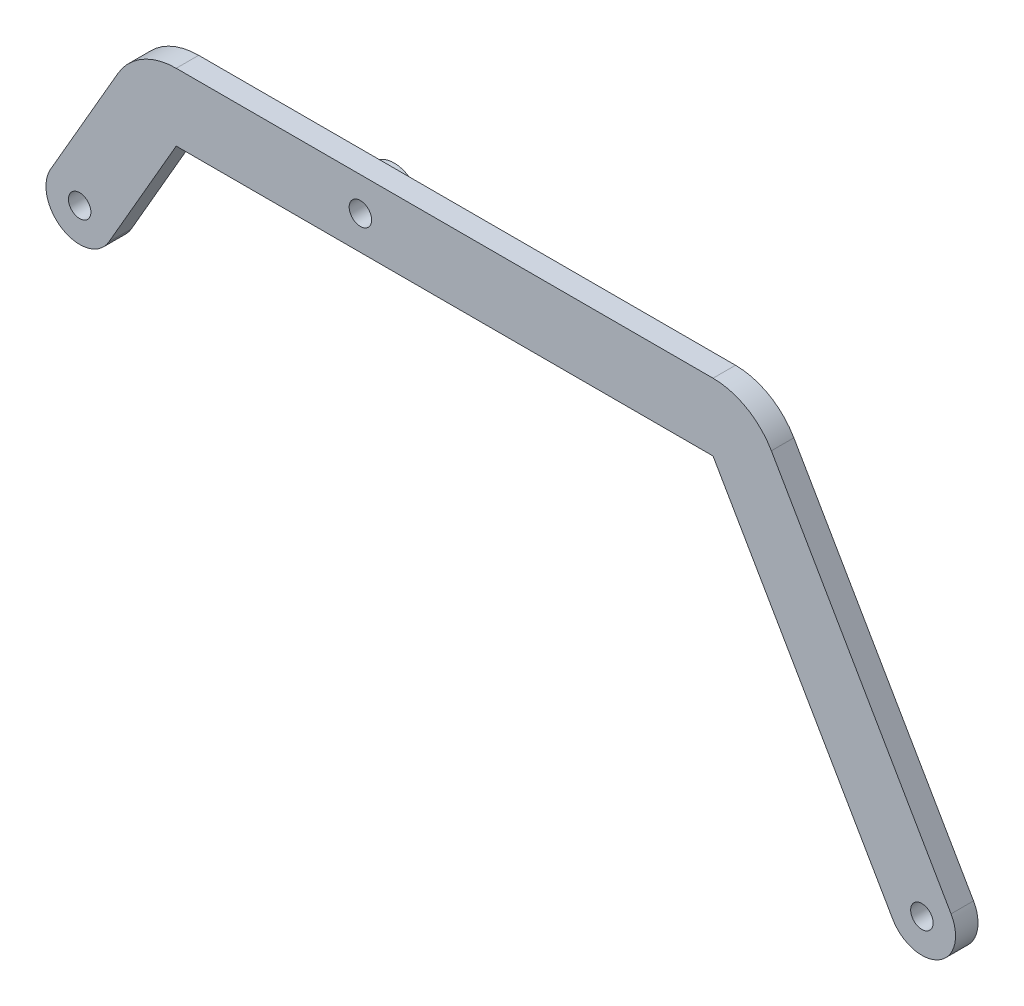
ISO-10303-21;
HEADER;
FILE_DESCRIPTION(('STEP AP214'),'2;1');
FILE_NAME('part.step','',(''),(''),'','','');
FILE_SCHEMA(('AUTOMOTIVE_DESIGN { 1 0 10303 214 1 1 1 1 }'));
ENDSEC;
DATA;
#1=APPLICATION_CONTEXT('core data for automotive mechanical design processes');
#2=APPLICATION_PROTOCOL_DEFINITION('international standard','automotive_design',2000,#1);
#3=PRODUCT_CONTEXT('',#1,'mechanical');
#4=PRODUCT('Part','Part','',(#3));
#5=PRODUCT_RELATED_PRODUCT_CATEGORY('part','',(#4));
#6=PRODUCT_DEFINITION_FORMATION('','',#4);
#7=PRODUCT_DEFINITION_CONTEXT('part definition',#1,'design');
#8=PRODUCT_DEFINITION('design','',#6,#7);
#9=PRODUCT_DEFINITION_SHAPE('','',#8);
#10=(LENGTH_UNIT() NAMED_UNIT(*) SI_UNIT(.MILLI.,.METRE.));
#11=(NAMED_UNIT(*) PLANE_ANGLE_UNIT() SI_UNIT($,.RADIAN.));
#12=(NAMED_UNIT(*) SI_UNIT($,.STERADIAN.) SOLID_ANGLE_UNIT());
#13=UNCERTAINTY_MEASURE_WITH_UNIT(LENGTH_MEASURE(1.E-05),#10,'distance_accuracy_value','');
#14=(GEOMETRIC_REPRESENTATION_CONTEXT(3) GLOBAL_UNCERTAINTY_ASSIGNED_CONTEXT((#13)) GLOBAL_UNIT_ASSIGNED_CONTEXT((#10,
#11,#12)) REPRESENTATION_CONTEXT('',''));
#15=CARTESIAN_POINT('',(0.,0.,0.));
#16=DIRECTION('',(0.,0.,1.));
#17=DIRECTION('',(1.,0.,0.));
#18=AXIS2_PLACEMENT_3D('',#15,#16,#17);
#19=CARTESIAN_POINT('',(-82.0096189432334,-15.,10.));
#20=DIRECTION('',(0.,0.,-1.));
#21=DIRECTION('',(-1.,0.,0.));
#22=AXIS2_PLACEMENT_3D('',#19,#20,#21);
#23=CYLINDRICAL_SURFACE('',#22,30.);
#24=CARTESIAN_POINT('',(-82.0096189432334,-15.,0.));
#25=DIRECTION('',(0.,0.,1.));
#26=DIRECTION('',(-1.,0.,0.));
#27=AXIS2_PLACEMENT_3D('',#24,#25,#26);
#28=CIRCLE('',#27,30.);
#29=CARTESIAN_POINT('',(-82.0096189432334,15.,0.));
#30=VERTEX_POINT('',#29);
#31=CARTESIAN_POINT('',(-107.990381056767,0.,0.));
#32=VERTEX_POINT('',#31);
#33=EDGE_CURVE('E153',#30,#32,#28,.T.);
#34=ORIENTED_EDGE('',*,*,#33,.T.);
#35=DIRECTION('',(0.,0.,-1.));
#36=VECTOR('',#35,1.);
#37=CARTESIAN_POINT('',(-107.990381056767,0.,10.));
#38=LINE('',#37,#36);
#39=CARTESIAN_POINT('',(-107.990381056767,0.,10.));
#40=VERTEX_POINT('',#39);
#41=EDGE_CURVE('E49',#40,#32,#38,.T.);
#42=ORIENTED_EDGE('',*,*,#41,.F.);
#43=CARTESIAN_POINT('',(-82.0096189432334,-15.,10.));
#44=DIRECTION('',(0.,0.,1.));
#45=DIRECTION('',(-1.,0.,0.));
#46=AXIS2_PLACEMENT_3D('',#43,#44,#45);
#47=CIRCLE('',#46,30.);
#48=CARTESIAN_POINT('',(-82.0096189432334,15.,10.));
#49=VERTEX_POINT('',#48);
#50=EDGE_CURVE('E107',#49,#40,#47,.T.);
#51=ORIENTED_EDGE('',*,*,#50,.F.);
#52=DIRECTION('',(0.,0.,-1.));
#53=VECTOR('',#52,1.);
#54=CARTESIAN_POINT('',(-82.0096189432334,15.,10.));
#55=LINE('',#54,#53);
#56=EDGE_CURVE('E11',#49,#30,#55,.T.);
#57=ORIENTED_EDGE('',*,*,#56,.T.);
#58=EDGE_LOOP('',(#34,#42,#51,#57));
#59=FACE_BOUND('',#58,.T.);
#60=ADVANCED_FACE('F41',(#59),#23,.T.);
#61=CARTESIAN_POINT('',(-137.990381056767,-51.9615242270663,10.));
#62=DIRECTION('',(0.866025403784438,-0.5,0.));
#63=DIRECTION('',(0.5,0.866025403784438,0.));
#64=AXIS2_PLACEMENT_3D('',#61,#62,#63);
#65=PLANE('',#64);
#66=DIRECTION('',(-0.5,-0.866025403784438,0.));
#67=VECTOR('',#66,1.);
#68=CARTESIAN_POINT('',(-137.990381056767,-51.9615242270663,0.));
#69=LINE('',#68,#67);
#70=CARTESIAN_POINT('',(-137.990381056767,-51.9615242270663,0.));
#71=VERTEX_POINT('',#70);
#72=EDGE_CURVE('E155',#32,#71,#69,.T.);
#73=ORIENTED_EDGE('',*,*,#72,.T.);
#74=DIRECTION('',(0.,0.,-1.));
#75=VECTOR('',#74,1.);
#76=CARTESIAN_POINT('',(-137.990381056767,-51.9615242270663,10.));
#77=LINE('',#76,#75);
#78=CARTESIAN_POINT('',(-137.990381056767,-51.9615242270663,10.));
#79=VERTEX_POINT('',#78);
#80=EDGE_CURVE('E184',#79,#71,#77,.T.);
#81=ORIENTED_EDGE('',*,*,#80,.F.);
#82=DIRECTION('',(-0.5,-0.866025403784438,0.));
#83=VECTOR('',#82,1.);
#84=CARTESIAN_POINT('',(-137.990381056767,-51.9615242270663,10.));
#85=LINE('',#84,#83);
#86=EDGE_CURVE('E192',#40,#79,#85,.T.);
#87=ORIENTED_EDGE('',*,*,#86,.F.);
#88=ORIENTED_EDGE('',*,*,#41,.T.);
#89=EDGE_LOOP('',(#73,#81,#87,#88));
#90=FACE_BOUND('',#89,.T.);
#91=ADVANCED_FACE('F190',(#90),#65,.F.);
#92=CARTESIAN_POINT('',(-125.,-59.4615242270663,10.));
#93=DIRECTION('',(0.,0.,-1.));
#94=DIRECTION('',(-1.,0.,0.));
#95=AXIS2_PLACEMENT_3D('',#92,#93,#94);
#96=CYLINDRICAL_SURFACE('',#95,15.);
#97=CARTESIAN_POINT('',(-125.,-59.4615242270663,0.));
#98=DIRECTION('',(0.,0.,1.));
#99=DIRECTION('',(1.,0.,0.));
#100=AXIS2_PLACEMENT_3D('',#97,#98,#99);
#101=CIRCLE('',#100,15.);
#102=CARTESIAN_POINT('',(-112.009618943233,-66.9615242270663,0.));
#103=VERTEX_POINT('',#102);
#104=EDGE_CURVE('E158',#71,#103,#101,.T.);
#105=ORIENTED_EDGE('',*,*,#104,.T.);
#106=DIRECTION('',(0.,0.,-1.));
#107=VECTOR('',#106,1.);
#108=CARTESIAN_POINT('',(-112.009618943233,-66.9615242270663,10.));
#109=LINE('',#108,#107);
#110=CARTESIAN_POINT('',(-112.009618943233,-66.9615242270663,10.));
#111=VERTEX_POINT('',#110);
#112=EDGE_CURVE('E181',#111,#103,#109,.T.);
#113=ORIENTED_EDGE('',*,*,#112,.F.);
#114=CARTESIAN_POINT('',(-125.,-59.4615242270663,10.));
#115=DIRECTION('',(0.,0.,1.));
#116=DIRECTION('',(1.,0.,0.));
#117=AXIS2_PLACEMENT_3D('',#114,#115,#116);
#118=CIRCLE('',#117,15.);
#119=EDGE_CURVE('E210',#79,#111,#118,.T.);
#120=ORIENTED_EDGE('',*,*,#119,.F.);
#121=ORIENTED_EDGE('',*,*,#80,.T.);
#122=EDGE_LOOP('',(#105,#113,#120,#121));
#123=FACE_BOUND('',#122,.T.);
#124=ADVANCED_FACE('F201',(#123),#96,.T.);
#125=CARTESIAN_POINT('',(-82.0096189432334,-15.,10.));
#126=DIRECTION('',(-0.866025403784439,0.5,0.));
#127=DIRECTION('',(-0.5,-0.866025403784439,0.));
#128=AXIS2_PLACEMENT_3D('',#125,#126,#127);
#129=PLANE('',#128);
#130=DIRECTION('',(0.5,0.866025403784438,0.));
#131=VECTOR('',#130,1.);
#132=CARTESIAN_POINT('',(-82.0096189432334,-15.,0.));
#133=LINE('',#132,#131);
#134=CARTESIAN_POINT('',(-82.0096189432334,-15.,0.));
#135=VERTEX_POINT('',#134);
#136=EDGE_CURVE('E160',#103,#135,#133,.T.);
#137=ORIENTED_EDGE('',*,*,#136,.T.);
#138=DIRECTION('',(0.,0.,-1.));
#139=VECTOR('',#138,1.);
#140=CARTESIAN_POINT('',(-82.0096189432334,-15.,10.));
#141=LINE('',#140,#139);
#142=CARTESIAN_POINT('',(-82.0096189432334,-15.,10.));
#143=VERTEX_POINT('',#142);
#144=EDGE_CURVE('E178',#143,#135,#141,.T.);
#145=ORIENTED_EDGE('',*,*,#144,.F.);
#146=DIRECTION('',(0.5,0.866025403784438,0.));
#147=VECTOR('',#146,1.);
#148=CARTESIAN_POINT('',(-82.0096189432334,-15.,10.));
#149=LINE('',#148,#147);
#150=EDGE_CURVE('E207',#111,#143,#149,.T.);
#151=ORIENTED_EDGE('',*,*,#150,.F.);
#152=ORIENTED_EDGE('',*,*,#112,.T.);
#153=EDGE_LOOP('',(#137,#145,#151,#152));
#154=FACE_BOUND('',#153,.T.);
#155=ADVANCED_FACE('F205',(#154),#129,.F.);
#156=CARTESIAN_POINT('',(0.,-15.,10.));
#157=DIRECTION('',(0.,1.,0.));
#158=DIRECTION('',(-1.,0.,0.));
#159=AXIS2_PLACEMENT_3D('',#156,#157,#158);
#160=PLANE('',#159);
#161=DIRECTION('',(1.,0.,0.));
#162=VECTOR('',#161,1.);
#163=CARTESIAN_POINT('',(0.,-15.,0.));
#164=LINE('',#163,#162);
#165=CARTESIAN_POINT('',(157.009618943233,-15.,0.));
#166=VERTEX_POINT('',#165);
#167=EDGE_CURVE('E163',#135,#166,#164,.T.);
#168=ORIENTED_EDGE('',*,*,#167,.T.);
#169=DIRECTION('',(0.,0.,-1.));
#170=VECTOR('',#169,1.);
#171=CARTESIAN_POINT('',(157.009618943233,-15.,10.));
#172=LINE('',#171,#170);
#173=CARTESIAN_POINT('',(157.009618943233,-15.,10.));
#174=VERTEX_POINT('',#173);
#175=EDGE_CURVE('E175',#174,#166,#172,.T.);
#176=ORIENTED_EDGE('',*,*,#175,.F.);
#177=DIRECTION('',(1.,0.,0.));
#178=VECTOR('',#177,1.);
#179=CARTESIAN_POINT('',(0.,-15.,10.));
#180=LINE('',#179,#178);
#181=EDGE_CURVE('E209',#143,#174,#180,.T.);
#182=ORIENTED_EDGE('',*,*,#181,.F.);
#183=ORIENTED_EDGE('',*,*,#144,.T.);
#184=EDGE_LOOP('',(#168,#176,#182,#183));
#185=FACE_BOUND('',#184,.T.);
#186=ADVANCED_FACE('F282',(#185),#160,.F.);
#187=CARTESIAN_POINT('',(157.009618943233,-15.,10.));
#188=DIRECTION('',(0.866025403784439,0.5,0.));
#189=DIRECTION('',(-0.5,0.866025403784439,0.));
#190=AXIS2_PLACEMENT_3D('',#187,#188,#189);
#191=PLANE('',#190);
#192=DIRECTION('',(0.5,-0.866025403784439,0.));
#193=VECTOR('',#192,1.);
#194=CARTESIAN_POINT('',(157.009618943233,-15.,0.));
#195=LINE('',#194,#193);
#196=CARTESIAN_POINT('',(237.009618943233,-153.564064605511,0.));
#197=VERTEX_POINT('',#196);
#198=EDGE_CURVE('E165',#166,#197,#195,.T.);
#199=ORIENTED_EDGE('',*,*,#198,.T.);
#200=DIRECTION('',(0.,0.,-1.));
#201=VECTOR('',#200,1.);
#202=CARTESIAN_POINT('',(237.009618943233,-153.564064605511,10.));
#203=LINE('',#202,#201);
#204=CARTESIAN_POINT('',(237.009618943233,-153.564064605511,10.));
#205=VERTEX_POINT('',#204);
#206=EDGE_CURVE('E142',#205,#197,#203,.T.);
#207=ORIENTED_EDGE('',*,*,#206,.F.);
#208=DIRECTION('',(0.5,-0.866025403784439,0.));
#209=VECTOR('',#208,1.);
#210=CARTESIAN_POINT('',(157.009618943233,-15.,10.));
#211=LINE('',#210,#209);
#212=EDGE_CURVE('E133',#174,#205,#211,.T.);
#213=ORIENTED_EDGE('',*,*,#212,.F.);
#214=ORIENTED_EDGE('',*,*,#175,.T.);
#215=EDGE_LOOP('',(#199,#207,#213,#214));
#216=FACE_BOUND('',#215,.T.);
#217=ADVANCED_FACE('F279',(#216),#191,.F.);
#218=CARTESIAN_POINT('',(250.,-146.064064605511,10.));
#219=DIRECTION('',(0.,0.,-1.));
#220=DIRECTION('',(-1.,0.,0.));
#221=AXIS2_PLACEMENT_3D('',#218,#219,#220);
#222=CYLINDRICAL_SURFACE('',#221,15.);
#223=CARTESIAN_POINT('',(250.,-146.064064605511,0.));
#224=DIRECTION('',(0.,0.,1.));
#225=DIRECTION('',(1.,0.,0.));
#226=AXIS2_PLACEMENT_3D('',#223,#224,#225);
#227=CIRCLE('',#226,15.);
#228=CARTESIAN_POINT('',(262.990381056767,-138.564064605511,0.));
#229=VERTEX_POINT('',#228);
#230=EDGE_CURVE('E141',#197,#229,#227,.T.);
#231=ORIENTED_EDGE('',*,*,#230,.T.);
#232=DIRECTION('',(0.,0.,-1.));
#233=VECTOR('',#232,1.);
#234=CARTESIAN_POINT('',(262.990381056767,-138.564064605511,10.));
#235=LINE('',#234,#233);
#236=CARTESIAN_POINT('',(262.990381056767,-138.564064605511,10.));
#237=VERTEX_POINT('',#236);
#238=EDGE_CURVE('E138',#237,#229,#235,.T.);
#239=ORIENTED_EDGE('',*,*,#238,.F.);
#240=CARTESIAN_POINT('',(250.,-146.064064605511,10.));
#241=DIRECTION('',(0.,0.,1.));
#242=DIRECTION('',(1.,0.,0.));
#243=AXIS2_PLACEMENT_3D('',#240,#241,#242);
#244=CIRCLE('',#243,15.);
#245=EDGE_CURVE('E127',#205,#237,#244,.T.);
#246=ORIENTED_EDGE('',*,*,#245,.F.);
#247=ORIENTED_EDGE('',*,*,#206,.T.);
#248=EDGE_LOOP('',(#231,#239,#246,#247));
#249=FACE_BOUND('',#248,.T.);
#250=ADVANCED_FACE('F139',(#249),#222,.T.);
#251=CARTESIAN_POINT('',(262.990381056767,-138.564064605511,10.));
#252=DIRECTION('',(-0.866025403784438,-0.5,0.));
#253=DIRECTION('',(0.5,-0.866025403784439,0.));
#254=AXIS2_PLACEMENT_3D('',#251,#252,#253);
#255=PLANE('',#254);
#256=DIRECTION('',(-0.5,0.866025403784438,0.));
#257=VECTOR('',#256,1.);
#258=CARTESIAN_POINT('',(262.990381056767,-138.564064605511,0.));
#259=LINE('',#258,#257);
#260=CARTESIAN_POINT('',(182.990381056766,0.,0.));
#261=VERTEX_POINT('',#260);
#262=EDGE_CURVE('E93',#229,#261,#259,.T.);
#263=ORIENTED_EDGE('',*,*,#262,.T.);
#264=DIRECTION('',(0.,0.,-1.));
#265=VECTOR('',#264,1.);
#266=CARTESIAN_POINT('',(182.990381056766,0.,10.));
#267=LINE('',#266,#265);
#268=CARTESIAN_POINT('',(182.990381056766,0.,10.));
#269=VERTEX_POINT('',#268);
#270=EDGE_CURVE('E143',#269,#261,#267,.T.);
#271=ORIENTED_EDGE('',*,*,#270,.F.);
#272=DIRECTION('',(-0.5,0.866025403784438,0.));
#273=VECTOR('',#272,1.);
#274=CARTESIAN_POINT('',(262.990381056767,-138.564064605511,10.));
#275=LINE('',#274,#273);
#276=EDGE_CURVE('E131',#237,#269,#275,.T.);
#277=ORIENTED_EDGE('',*,*,#276,.F.);
#278=ORIENTED_EDGE('',*,*,#238,.T.);
#279=EDGE_LOOP('',(#263,#271,#277,#278));
#280=FACE_BOUND('',#279,.T.);
#281=ADVANCED_FACE('F145',(#280),#255,.F.);
#282=CARTESIAN_POINT('',(157.009618943233,-15.,10.));
#283=DIRECTION('',(0.,0.,-1.));
#284=DIRECTION('',(-1.,0.,0.));
#285=AXIS2_PLACEMENT_3D('',#282,#283,#284);
#286=CYLINDRICAL_SURFACE('',#285,30.);
#287=CARTESIAN_POINT('',(157.009618943233,-15.,0.));
#288=DIRECTION('',(0.,0.,1.));
#289=DIRECTION('',(1.,0.,0.));
#290=AXIS2_PLACEMENT_3D('',#287,#288,#289);
#291=CIRCLE('',#290,30.);
#292=CARTESIAN_POINT('',(157.009618943233,15.,0.));
#293=VERTEX_POINT('',#292);
#294=EDGE_CURVE('E100',#261,#293,#291,.T.);
#295=ORIENTED_EDGE('',*,*,#294,.T.);
#296=DIRECTION('',(0.,0.,-1.));
#297=VECTOR('',#296,1.);
#298=CARTESIAN_POINT('',(157.009618943233,15.,10.));
#299=LINE('',#298,#297);
#300=CARTESIAN_POINT('',(157.009618943233,15.,10.));
#301=VERTEX_POINT('',#300);
#302=EDGE_CURVE('E149',#301,#293,#299,.T.);
#303=ORIENTED_EDGE('',*,*,#302,.F.);
#304=CARTESIAN_POINT('',(157.009618943233,-15.,10.));
#305=DIRECTION('',(0.,0.,1.));
#306=DIRECTION('',(1.,0.,0.));
#307=AXIS2_PLACEMENT_3D('',#304,#305,#306);
#308=CIRCLE('',#307,30.);
#309=EDGE_CURVE('E147',#269,#301,#308,.T.);
#310=ORIENTED_EDGE('',*,*,#309,.F.);
#311=ORIENTED_EDGE('',*,*,#270,.T.);
#312=EDGE_LOOP('',(#295,#303,#310,#311));
#313=FACE_BOUND('',#312,.T.);
#314=ADVANCED_FACE('F332',(#313),#286,.T.);
#315=CARTESIAN_POINT('',(0.,15.,10.));
#316=DIRECTION('',(0.,-1.,0.));
#317=DIRECTION('',(1.,0.,0.));
#318=AXIS2_PLACEMENT_3D('',#315,#316,#317);
#319=PLANE('',#318);
#320=DIRECTION('',(-1.,0.,0.));
#321=VECTOR('',#320,1.);
#322=CARTESIAN_POINT('',(0.,15.,0.));
#323=LINE('',#322,#321);
#324=EDGE_CURVE('E170',#293,#30,#323,.T.);
#325=ORIENTED_EDGE('',*,*,#324,.T.);
#326=ORIENTED_EDGE('',*,*,#56,.F.);
#327=DIRECTION('',(-1.,0.,0.));
#328=VECTOR('',#327,1.);
#329=CARTESIAN_POINT('',(0.,15.,10.));
#330=LINE('',#329,#328);
#331=EDGE_CURVE('E57',#301,#49,#330,.T.);
#332=ORIENTED_EDGE('',*,*,#331,.F.);
#333=ORIENTED_EDGE('',*,*,#302,.T.);
#334=EDGE_LOOP('',(#325,#326,#332,#333));
#335=FACE_BOUND('',#334,.T.);
#336=ADVANCED_FACE('F276',(#335),#319,.F.);
#337=CARTESIAN_POINT('',(-82.0096189432334,-15.,10.));
#338=DIRECTION('',(0.,0.,-1.));
#339=DIRECTION('',(-1.,0.,0.));
#340=AXIS2_PLACEMENT_3D('',#337,#338,#339);
#341=PLANE('',#340);
#342=CARTESIAN_POINT('',(-125.,-59.4615242270663,10.));
#343=DIRECTION('',(0.,0.,1.));
#344=DIRECTION('',(1.,0.,0.));
#345=AXIS2_PLACEMENT_3D('',#342,#343,#344);
#346=CIRCLE('',#345,5.00000000000001);
#347=CARTESIAN_POINT('',(-120.,-59.4615242270663,10.));
#348=VERTEX_POINT('',#347);
#349=EDGE_CURVE('E229',#348,#348,#346,.T.);
#350=ORIENTED_EDGE('',*,*,#349,.F.);
#351=EDGE_LOOP('',(#350));
#352=FACE_BOUND('',#351,.T.);
#353=CARTESIAN_POINT('',(250.,-146.064064605511,10.));
#354=DIRECTION('',(0.,0.,1.));
#355=DIRECTION('',(1.,0.,0.));
#356=AXIS2_PLACEMENT_3D('',#353,#354,#355);
#357=CIRCLE('',#356,4.99999999999999);
#358=CARTESIAN_POINT('',(255.,-146.064064605511,10.));
#359=VERTEX_POINT('',#358);
#360=EDGE_CURVE('E226',#359,#359,#357,.T.);
#361=ORIENTED_EDGE('',*,*,#360,.F.);
#362=EDGE_LOOP('',(#361));
#363=FACE_BOUND('',#362,.T.);
#364=CARTESIAN_POINT('',(0.,0.,10.));
#365=DIRECTION('',(0.,0.,1.));
#366=DIRECTION('',(1.,0.,0.));
#367=AXIS2_PLACEMENT_3D('',#364,#365,#366);
#368=CIRCLE('',#367,5.);
#369=CARTESIAN_POINT('',(5.,0.,10.));
#370=VERTEX_POINT('',#369);
#371=EDGE_CURVE('E218',#370,#370,#368,.T.);
#372=ORIENTED_EDGE('',*,*,#371,.F.);
#373=EDGE_LOOP('',(#372));
#374=FACE_BOUND('',#373,.T.);
#375=ORIENTED_EDGE('',*,*,#331,.T.);
#376=ORIENTED_EDGE('',*,*,#50,.T.);
#377=ORIENTED_EDGE('',*,*,#86,.T.);
#378=ORIENTED_EDGE('',*,*,#119,.T.);
#379=ORIENTED_EDGE('',*,*,#150,.T.);
#380=ORIENTED_EDGE('',*,*,#181,.T.);
#381=ORIENTED_EDGE('',*,*,#212,.T.);
#382=ORIENTED_EDGE('',*,*,#245,.T.);
#383=ORIENTED_EDGE('',*,*,#276,.T.);
#384=ORIENTED_EDGE('',*,*,#309,.T.);
#385=EDGE_LOOP('',(#375,#376,#377,#378,#379,#380,#381,#382,#383,#384));
#386=FACE_BOUND('',#385,.T.);
#387=ADVANCED_FACE('F129',(#352,#363,#374,#386),#341,.F.);
#388=CARTESIAN_POINT('',(-82.0096189432334,-15.,0.));
#389=DIRECTION('',(0.,0.,-1.));
#390=DIRECTION('',(-1.,0.,0.));
#391=AXIS2_PLACEMENT_3D('',#388,#389,#390);
#392=PLANE('',#391);
#393=CARTESIAN_POINT('',(0.,0.,0.));
#394=DIRECTION('',(0.,0.,-1.));
#395=DIRECTION('',(-1.,0.,0.));
#396=AXIS2_PLACEMENT_3D('',#393,#394,#395);
#397=CIRCLE('',#396,12.);
#398=CARTESIAN_POINT('',(-12.,0.,0.));
#399=VERTEX_POINT('',#398);
#400=EDGE_CURVE('E236',#399,#399,#397,.T.);
#401=ORIENTED_EDGE('',*,*,#400,.F.);
#402=EDGE_LOOP('',(#401));
#403=FACE_BOUND('',#402,.T.);
#404=CARTESIAN_POINT('',(-125.,-59.4615242270663,0.));
#405=DIRECTION('',(0.,0.,-1.));
#406=DIRECTION('',(-1.,0.,0.));
#407=AXIS2_PLACEMENT_3D('',#404,#405,#406);
#408=CIRCLE('',#407,5.00000000000001);
#409=CARTESIAN_POINT('',(-130.,-59.4615242270663,0.));
#410=VERTEX_POINT('',#409);
#411=EDGE_CURVE('E156',#410,#410,#408,.F.);
#412=ORIENTED_EDGE('',*,*,#411,.T.);
#413=EDGE_LOOP('',(#412));
#414=FACE_BOUND('',#413,.T.);
#415=CARTESIAN_POINT('',(250.,-146.064064605511,0.));
#416=DIRECTION('',(0.,0.,-1.));
#417=DIRECTION('',(-1.,0.,0.));
#418=AXIS2_PLACEMENT_3D('',#415,#416,#417);
#419=CIRCLE('',#418,4.99999999999999);
#420=CARTESIAN_POINT('',(245.,-146.064064605511,0.));
#421=VERTEX_POINT('',#420);
#422=EDGE_CURVE('E221',#421,#421,#419,.F.);
#423=ORIENTED_EDGE('',*,*,#422,.T.);
#424=EDGE_LOOP('',(#423));
#425=FACE_BOUND('',#424,.T.);
#426=ORIENTED_EDGE('',*,*,#33,.F.);
#427=ORIENTED_EDGE('',*,*,#324,.F.);
#428=ORIENTED_EDGE('',*,*,#294,.F.);
#429=ORIENTED_EDGE('',*,*,#262,.F.);
#430=ORIENTED_EDGE('',*,*,#230,.F.);
#431=ORIENTED_EDGE('',*,*,#198,.F.);
#432=ORIENTED_EDGE('',*,*,#167,.F.);
#433=ORIENTED_EDGE('',*,*,#136,.F.);
#434=ORIENTED_EDGE('',*,*,#104,.F.);
#435=ORIENTED_EDGE('',*,*,#72,.F.);
#436=EDGE_LOOP('',(#426,#427,#428,#429,#430,#431,#432,#433,#434,#435));
#437=FACE_BOUND('',#436,.T.);
#438=ADVANCED_FACE('F196',(#403,#414,#425,#437),#392,.T.);
#439=CARTESIAN_POINT('',(0.,0.,-14.142135623731));
#440=DIRECTION('',(0.,0.,1.));
#441=DIRECTION('',(1.,0.,0.));
#442=AXIS2_PLACEMENT_3D('',#439,#440,#441);
#443=CYLINDRICAL_SURFACE('',#442,5.);
#444=ORIENTED_EDGE('',*,*,#371,.T.);
#445=EDGE_LOOP('',(#444));
#446=FACE_BOUND('',#445,.T.);
#447=CARTESIAN_POINT('',(0.,0.,0.));
#448=DIRECTION('',(0.,0.,-1.));
#449=DIRECTION('',(-1.,0.,0.));
#450=AXIS2_PLACEMENT_3D('',#447,#448,#449);
#451=CIRCLE('',#450,5.);
#452=CARTESIAN_POINT('',(-5.,0.,0.));
#453=VERTEX_POINT('',#452);
#454=EDGE_CURVE('E222',#453,#453,#451,.F.);
#455=ORIENTED_EDGE('',*,*,#454,.F.);
#456=EDGE_LOOP('',(#455));
#457=FACE_BOUND('',#456,.T.);
#458=ADVANCED_FACE('F253',(#446,#457),#443,.F.);
#459=CARTESIAN_POINT('',(250.,-146.064064605511,-14.142135623731));
#460=DIRECTION('',(0.,0.,1.));
#461=DIRECTION('',(1.,0.,0.));
#462=AXIS2_PLACEMENT_3D('',#459,#460,#461);
#463=CYLINDRICAL_SURFACE('',#462,4.99999999999999);
#464=ORIENTED_EDGE('',*,*,#360,.T.);
#465=EDGE_LOOP('',(#464));
#466=FACE_BOUND('',#465,.T.);
#467=ORIENTED_EDGE('',*,*,#422,.F.);
#468=EDGE_LOOP('',(#467));
#469=FACE_BOUND('',#468,.T.);
#470=ADVANCED_FACE('F259',(#466,#469),#463,.F.);
#471=CARTESIAN_POINT('',(-125.,-59.4615242270663,-14.142135623731));
#472=DIRECTION('',(0.,0.,1.));
#473=DIRECTION('',(1.,0.,0.));
#474=AXIS2_PLACEMENT_3D('',#471,#472,#473);
#475=CYLINDRICAL_SURFACE('',#474,5.00000000000001);
#476=ORIENTED_EDGE('',*,*,#349,.T.);
#477=EDGE_LOOP('',(#476));
#478=FACE_BOUND('',#477,.T.);
#479=ORIENTED_EDGE('',*,*,#411,.F.);
#480=EDGE_LOOP('',(#479));
#481=FACE_BOUND('',#480,.T.);
#482=ADVANCED_FACE('F261',(#478,#481),#475,.F.);
#483=CARTESIAN_POINT('',(0.,0.,0.));
#484=DIRECTION('',(0.,0.,-1.));
#485=DIRECTION('',(-1.,0.,0.));
#486=AXIS2_PLACEMENT_3D('',#483,#484,#485);
#487=PLANE('',#486);
#488=ORIENTED_EDGE('',*,*,#454,.T.);
#489=EDGE_LOOP('',(#488));
#490=FACE_BOUND('',#489,.T.);
#491=ADVANCED_FACE('F247',(#490),#487,.F.);
#492=CARTESIAN_POINT('',(0.,0.,-5.));
#493=DIRECTION('',(0.,0.,1.));
#494=DIRECTION('',(1.,0.,0.));
#495=AXIS2_PLACEMENT_3D('',#492,#493,#494);
#496=CYLINDRICAL_SURFACE('',#495,12.);
#497=CARTESIAN_POINT('',(0.,0.,-5.));
#498=DIRECTION('',(0.,0.,-1.));
#499=DIRECTION('',(-1.,0.,0.));
#500=AXIS2_PLACEMENT_3D('',#497,#498,#499);
#501=CIRCLE('',#500,12.);
#502=CARTESIAN_POINT('',(-12.,0.,-5.));
#503=VERTEX_POINT('',#502);
#504=EDGE_CURVE('E225',#503,#503,#501,.T.);
#505=ORIENTED_EDGE('',*,*,#504,.F.);
#506=EDGE_LOOP('',(#505));
#507=FACE_BOUND('',#506,.T.);
#508=ORIENTED_EDGE('',*,*,#400,.T.);
#509=EDGE_LOOP('',(#508));
#510=FACE_BOUND('',#509,.T.);
#511=ADVANCED_FACE('F244',(#507,#510),#496,.T.);
#512=CARTESIAN_POINT('',(0.,0.,-5.));
#513=DIRECTION('',(0.,0.,-1.));
#514=DIRECTION('',(-1.,0.,0.));
#515=AXIS2_PLACEMENT_3D('',#512,#513,#514);
#516=PLANE('',#515);
#517=ORIENTED_EDGE('',*,*,#504,.T.);
#518=EDGE_LOOP('',(#517));
#519=FACE_BOUND('',#518,.T.);
#520=ADVANCED_FACE('F242',(#519),#516,.T.);
#521=CLOSED_SHELL('',(#60,#91,#124,#155,#186,#217,#250,#281,#314,#336,#387,#438,#458,#470,#482,
#491,#511,#520));
#522=MANIFOLD_SOLID_BREP('B2',#521);
#523=ADVANCED_BREP_SHAPE_REPRESENTATION('',(#18,#522),#14);
#524=SHAPE_DEFINITION_REPRESENTATION(#9,#523);
ENDSEC;
END-ISO-10303-21;
